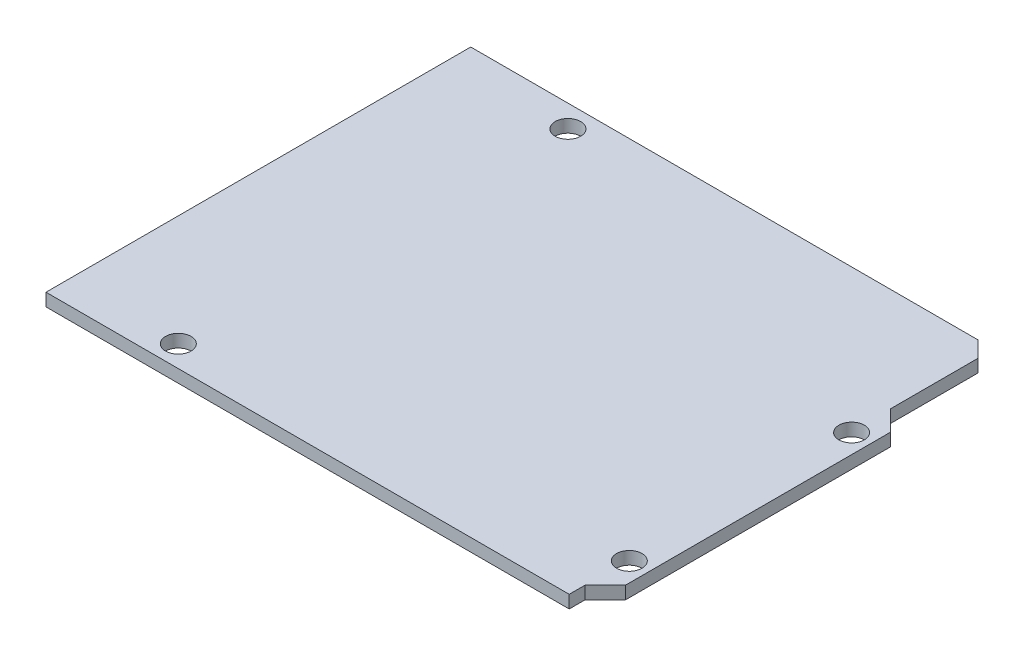
ISO-10303-21;
HEADER;
FILE_DESCRIPTION(('STEP AP214'),'2;1');
FILE_NAME('part.step','',(''),(''),'','','');
FILE_SCHEMA(('AUTOMOTIVE_DESIGN { 1 0 10303 214 1 1 1 1 }'));
ENDSEC;
DATA;
#1=APPLICATION_CONTEXT('core data for automotive mechanical design processes');
#2=APPLICATION_PROTOCOL_DEFINITION('international standard','automotive_design',2000,#1);
#3=PRODUCT_CONTEXT('',#1,'mechanical');
#4=PRODUCT('Part','Part','',(#3));
#5=PRODUCT_RELATED_PRODUCT_CATEGORY('part','',(#4));
#6=PRODUCT_DEFINITION_FORMATION('','',#4);
#7=PRODUCT_DEFINITION_CONTEXT('part definition',#1,'design');
#8=PRODUCT_DEFINITION('design','',#6,#7);
#9=PRODUCT_DEFINITION_SHAPE('','',#8);
#10=(LENGTH_UNIT() NAMED_UNIT(*) SI_UNIT(.MILLI.,.METRE.));
#11=(NAMED_UNIT(*) PLANE_ANGLE_UNIT() SI_UNIT($,.RADIAN.));
#12=(NAMED_UNIT(*) SI_UNIT($,.STERADIAN.) SOLID_ANGLE_UNIT());
#13=UNCERTAINTY_MEASURE_WITH_UNIT(LENGTH_MEASURE(1.E-05),#10,'distance_accuracy_value','');
#14=(GEOMETRIC_REPRESENTATION_CONTEXT(3) GLOBAL_UNCERTAINTY_ASSIGNED_CONTEXT((#13)) GLOBAL_UNIT_ASSIGNED_CONTEXT((#10,
#11,#12)) REPRESENTATION_CONTEXT('',''));
#15=CARTESIAN_POINT('',(0.,0.,0.));
#16=DIRECTION('',(0.,0.,1.));
#17=DIRECTION('',(1.,0.,0.));
#18=AXIS2_PLACEMENT_3D('',#15,#16,#17);
#19=CARTESIAN_POINT('',(31.56,1.6,26.65));
#20=DIRECTION('',(0.,0.,-1.));
#21=DIRECTION('',(-1.,0.,0.));
#22=AXIS2_PLACEMENT_3D('',#19,#20,#21);
#23=PLANE('',#22);
#24=DIRECTION('',(1.,0.,0.));
#25=VECTOR('',#24,1.);
#26=CARTESIAN_POINT('',(31.56,0.,26.65));
#27=LINE('',#26,#25);
#28=CARTESIAN_POINT('',(-34.1,0.,26.65));
#29=VERTEX_POINT('',#28);
#30=CARTESIAN_POINT('',(31.56,0.,26.65));
#31=VERTEX_POINT('',#30);
#32=EDGE_CURVE('E135',#29,#31,#27,.T.);
#33=ORIENTED_EDGE('',*,*,#32,.T.);
#34=DIRECTION('',(0.,-1.,0.));
#35=VECTOR('',#34,1.);
#36=CARTESIAN_POINT('',(31.56,1.6,26.65));
#37=LINE('',#36,#35);
#38=CARTESIAN_POINT('',(31.56,1.6,26.65));
#39=VERTEX_POINT('',#38);
#40=EDGE_CURVE('E11',#39,#31,#37,.T.);
#41=ORIENTED_EDGE('',*,*,#40,.F.);
#42=DIRECTION('',(1.,0.,0.));
#43=VECTOR('',#42,1.);
#44=CARTESIAN_POINT('',(31.56,1.6,26.65));
#45=LINE('',#44,#43);
#46=CARTESIAN_POINT('',(-34.1,1.6,26.65));
#47=VERTEX_POINT('',#46);
#48=EDGE_CURVE('E152',#47,#39,#45,.T.);
#49=ORIENTED_EDGE('',*,*,#48,.F.);
#50=DIRECTION('',(0.,-1.,0.));
#51=VECTOR('',#50,1.);
#52=CARTESIAN_POINT('',(-34.1,1.6,26.65));
#53=LINE('',#52,#51);
#54=EDGE_CURVE('E131',#47,#29,#53,.T.);
#55=ORIENTED_EDGE('',*,*,#54,.T.);
#56=EDGE_LOOP('',(#33,#41,#49,#55));
#57=FACE_BOUND('',#56,.T.);
#58=ADVANCED_FACE('F33',(#57),#23,.F.);
#59=CARTESIAN_POINT('',(31.56,1.6,24.65));
#60=DIRECTION('',(-1.,0.,0.));
#61=DIRECTION('',(0.,0.,1.));
#62=AXIS2_PLACEMENT_3D('',#59,#60,#61);
#63=PLANE('',#62);
#64=DIRECTION('',(0.,0.,-1.));
#65=VECTOR('',#64,1.);
#66=CARTESIAN_POINT('',(31.56,0.,24.65));
#67=LINE('',#66,#65);
#68=CARTESIAN_POINT('',(31.56,0.,24.65));
#69=VERTEX_POINT('',#68);
#70=EDGE_CURVE('E138',#31,#69,#67,.T.);
#71=ORIENTED_EDGE('',*,*,#70,.T.);
#72=DIRECTION('',(0.,-1.,0.));
#73=VECTOR('',#72,1.);
#74=CARTESIAN_POINT('',(31.56,1.6,24.65));
#75=LINE('',#74,#73);
#76=CARTESIAN_POINT('',(31.56,1.6,24.65));
#77=VERTEX_POINT('',#76);
#78=EDGE_CURVE('E41',#77,#69,#75,.T.);
#79=ORIENTED_EDGE('',*,*,#78,.F.);
#80=DIRECTION('',(0.,0.,-1.));
#81=VECTOR('',#80,1.);
#82=CARTESIAN_POINT('',(31.56,1.6,24.65));
#83=LINE('',#82,#81);
#84=EDGE_CURVE('E95',#39,#77,#83,.T.);
#85=ORIENTED_EDGE('',*,*,#84,.F.);
#86=ORIENTED_EDGE('',*,*,#40,.T.);
#87=EDGE_LOOP('',(#71,#79,#85,#86));
#88=FACE_BOUND('',#87,.T.);
#89=ADVANCED_FACE('F251',(#88),#63,.F.);
#90=CARTESIAN_POINT('',(34.1,1.6,22.11));
#91=DIRECTION('',(-0.707106781186551,0.,-0.707106781186544));
#92=DIRECTION('',(-0.707106781186544,0.,0.707106781186551));
#93=AXIS2_PLACEMENT_3D('',#90,#91,#92);
#94=PLANE('',#93);
#95=DIRECTION('',(0.707106781186544,0.,-0.707106781186551));
#96=VECTOR('',#95,1.);
#97=CARTESIAN_POINT('',(34.1,0.,22.11));
#98=LINE('',#97,#96);
#99=CARTESIAN_POINT('',(34.1,0.,22.11));
#100=VERTEX_POINT('',#99);
#101=EDGE_CURVE('E141',#69,#100,#98,.T.);
#102=ORIENTED_EDGE('',*,*,#101,.T.);
#103=DIRECTION('',(0.,-1.,0.));
#104=VECTOR('',#103,1.);
#105=CARTESIAN_POINT('',(34.1,1.6,22.11));
#106=LINE('',#105,#104);
#107=CARTESIAN_POINT('',(34.1,1.6,22.11));
#108=VERTEX_POINT('',#107);
#109=EDGE_CURVE('E162',#108,#100,#106,.T.);
#110=ORIENTED_EDGE('',*,*,#109,.F.);
#111=DIRECTION('',(0.707106781186544,0.,-0.707106781186551));
#112=VECTOR('',#111,1.);
#113=CARTESIAN_POINT('',(34.1,1.6,22.11));
#114=LINE('',#113,#112);
#115=EDGE_CURVE('E170',#77,#108,#114,.T.);
#116=ORIENTED_EDGE('',*,*,#115,.F.);
#117=ORIENTED_EDGE('',*,*,#78,.T.);
#118=EDGE_LOOP('',(#102,#110,#116,#117));
#119=FACE_BOUND('',#118,.T.);
#120=ADVANCED_FACE('F168',(#119),#94,.F.);
#121=CARTESIAN_POINT('',(34.1,1.6,-11.16));
#122=DIRECTION('',(-1.,0.,0.));
#123=DIRECTION('',(0.,0.,1.));
#124=AXIS2_PLACEMENT_3D('',#121,#122,#123);
#125=PLANE('',#124);
#126=DIRECTION('',(0.,0.,-1.));
#127=VECTOR('',#126,1.);
#128=CARTESIAN_POINT('',(34.1,0.,-11.16));
#129=LINE('',#128,#127);
#130=CARTESIAN_POINT('',(34.1,0.,-11.16));
#131=VERTEX_POINT('',#130);
#132=EDGE_CURVE('E143',#100,#131,#129,.T.);
#133=ORIENTED_EDGE('',*,*,#132,.T.);
#134=DIRECTION('',(0.,-1.,0.));
#135=VECTOR('',#134,1.);
#136=CARTESIAN_POINT('',(34.1,1.6,-11.16));
#137=LINE('',#136,#135);
#138=CARTESIAN_POINT('',(34.1,1.6,-11.16));
#139=VERTEX_POINT('',#138);
#140=EDGE_CURVE('E159',#139,#131,#137,.T.);
#141=ORIENTED_EDGE('',*,*,#140,.F.);
#142=DIRECTION('',(0.,0.,-1.));
#143=VECTOR('',#142,1.);
#144=CARTESIAN_POINT('',(34.1,1.6,-11.16));
#145=LINE('',#144,#143);
#146=EDGE_CURVE('E186',#108,#139,#145,.T.);
#147=ORIENTED_EDGE('',*,*,#146,.F.);
#148=ORIENTED_EDGE('',*,*,#109,.T.);
#149=EDGE_LOOP('',(#133,#141,#147,#148));
#150=FACE_BOUND('',#149,.T.);
#151=ADVANCED_FACE('F179',(#150),#125,.F.);
#152=CARTESIAN_POINT('',(31.56,1.6,-13.7));
#153=DIRECTION('',(-0.707106781186546,0.,0.707106781186549));
#154=DIRECTION('',(0.707106781186549,0.,0.707106781186546));
#155=AXIS2_PLACEMENT_3D('',#152,#153,#154);
#156=PLANE('',#155);
#157=DIRECTION('',(-0.707106781186549,0.,-0.707106781186546));
#158=VECTOR('',#157,1.);
#159=CARTESIAN_POINT('',(31.56,0.,-13.7));
#160=LINE('',#159,#158);
#161=CARTESIAN_POINT('',(31.56,0.,-13.7));
#162=VERTEX_POINT('',#161);
#163=EDGE_CURVE('E145',#131,#162,#160,.T.);
#164=ORIENTED_EDGE('',*,*,#163,.T.);
#165=DIRECTION('',(0.,-1.,0.));
#166=VECTOR('',#165,1.);
#167=CARTESIAN_POINT('',(31.56,1.6,-13.7));
#168=LINE('',#167,#166);
#169=CARTESIAN_POINT('',(31.56,1.6,-13.7));
#170=VERTEX_POINT('',#169);
#171=EDGE_CURVE('E156',#170,#162,#168,.T.);
#172=ORIENTED_EDGE('',*,*,#171,.F.);
#173=DIRECTION('',(-0.707106781186549,0.,-0.707106781186546));
#174=VECTOR('',#173,1.);
#175=CARTESIAN_POINT('',(31.56,1.6,-13.7));
#176=LINE('',#175,#174);
#177=EDGE_CURVE('E185',#139,#170,#176,.T.);
#178=ORIENTED_EDGE('',*,*,#177,.F.);
#179=ORIENTED_EDGE('',*,*,#140,.T.);
#180=EDGE_LOOP('',(#164,#172,#178,#179));
#181=FACE_BOUND('',#180,.T.);
#182=ADVANCED_FACE('F183',(#181),#156,.F.);
#183=CARTESIAN_POINT('',(31.56,1.6,-24.65));
#184=DIRECTION('',(-1.,0.,0.));
#185=DIRECTION('',(0.,0.,1.));
#186=AXIS2_PLACEMENT_3D('',#183,#184,#185);
#187=PLANE('',#186);
#188=DIRECTION('',(0.,0.,-1.));
#189=VECTOR('',#188,1.);
#190=CARTESIAN_POINT('',(31.56,0.,-24.65));
#191=LINE('',#190,#189);
#192=CARTESIAN_POINT('',(31.56,0.,-24.65));
#193=VERTEX_POINT('',#192);
#194=EDGE_CURVE('E147',#162,#193,#191,.T.);
#195=ORIENTED_EDGE('',*,*,#194,.T.);
#196=DIRECTION('',(0.,-1.,0.));
#197=VECTOR('',#196,1.);
#198=CARTESIAN_POINT('',(31.56,1.6,-24.65));
#199=LINE('',#198,#197);
#200=CARTESIAN_POINT('',(31.56,1.6,-24.65));
#201=VERTEX_POINT('',#200);
#202=EDGE_CURVE('E126',#201,#193,#199,.T.);
#203=ORIENTED_EDGE('',*,*,#202,.F.);
#204=DIRECTION('',(0.,0.,-1.));
#205=VECTOR('',#204,1.);
#206=CARTESIAN_POINT('',(31.56,1.6,-24.65));
#207=LINE('',#206,#205);
#208=EDGE_CURVE('E117',#170,#201,#207,.T.);
#209=ORIENTED_EDGE('',*,*,#208,.F.);
#210=ORIENTED_EDGE('',*,*,#171,.T.);
#211=EDGE_LOOP('',(#195,#203,#209,#210));
#212=FACE_BOUND('',#211,.T.);
#213=ADVANCED_FACE('F259',(#212),#187,.F.);
#214=CARTESIAN_POINT('',(29.56,1.6,-26.65));
#215=DIRECTION('',(-0.707106781186546,0.,0.707106781186549));
#216=DIRECTION('',(0.707106781186549,0.,0.707106781186546));
#217=AXIS2_PLACEMENT_3D('',#214,#215,#216);
#218=PLANE('',#217);
#219=DIRECTION('',(-0.707106781186549,0.,-0.707106781186546));
#220=VECTOR('',#219,1.);
#221=CARTESIAN_POINT('',(29.56,0.,-26.65));
#222=LINE('',#221,#220);
#223=CARTESIAN_POINT('',(29.56,0.,-26.65));
#224=VERTEX_POINT('',#223);
#225=EDGE_CURVE('E125',#193,#224,#222,.T.);
#226=ORIENTED_EDGE('',*,*,#225,.T.);
#227=DIRECTION('',(0.,-1.,0.));
#228=VECTOR('',#227,1.);
#229=CARTESIAN_POINT('',(29.56,1.6,-26.65));
#230=LINE('',#229,#228);
#231=CARTESIAN_POINT('',(29.56,1.6,-26.65));
#232=VERTEX_POINT('',#231);
#233=EDGE_CURVE('E122',#232,#224,#230,.T.);
#234=ORIENTED_EDGE('',*,*,#233,.F.);
#235=DIRECTION('',(-0.707106781186549,0.,-0.707106781186546));
#236=VECTOR('',#235,1.);
#237=CARTESIAN_POINT('',(29.56,1.6,-26.65));
#238=LINE('',#237,#236);
#239=EDGE_CURVE('E111',#201,#232,#238,.T.);
#240=ORIENTED_EDGE('',*,*,#239,.F.);
#241=ORIENTED_EDGE('',*,*,#202,.T.);
#242=EDGE_LOOP('',(#226,#234,#240,#241));
#243=FACE_BOUND('',#242,.T.);
#244=ADVANCED_FACE('F123',(#243),#218,.F.);
#245=CARTESIAN_POINT('',(-34.1,1.6,-26.65));
#246=DIRECTION('',(0.,0.,1.));
#247=DIRECTION('',(1.,0.,0.));
#248=AXIS2_PLACEMENT_3D('',#245,#246,#247);
#249=PLANE('',#248);
#250=DIRECTION('',(-1.,0.,0.));
#251=VECTOR('',#250,1.);
#252=CARTESIAN_POINT('',(-34.1,0.,-26.65));
#253=LINE('',#252,#251);
#254=CARTESIAN_POINT('',(-34.1,0.,-26.65));
#255=VERTEX_POINT('',#254);
#256=EDGE_CURVE('E81',#224,#255,#253,.T.);
#257=ORIENTED_EDGE('',*,*,#256,.T.);
#258=DIRECTION('',(0.,-1.,0.));
#259=VECTOR('',#258,1.);
#260=CARTESIAN_POINT('',(-34.1,1.6,-26.65));
#261=LINE('',#260,#259);
#262=CARTESIAN_POINT('',(-34.1,1.6,-26.65));
#263=VERTEX_POINT('',#262);
#264=EDGE_CURVE('E127',#263,#255,#261,.T.);
#265=ORIENTED_EDGE('',*,*,#264,.F.);
#266=DIRECTION('',(-1.,0.,0.));
#267=VECTOR('',#266,1.);
#268=CARTESIAN_POINT('',(-34.1,1.6,-26.65));
#269=LINE('',#268,#267);
#270=EDGE_CURVE('E115',#232,#263,#269,.T.);
#271=ORIENTED_EDGE('',*,*,#270,.F.);
#272=ORIENTED_EDGE('',*,*,#233,.T.);
#273=EDGE_LOOP('',(#257,#265,#271,#272));
#274=FACE_BOUND('',#273,.T.);
#275=ADVANCED_FACE('F129',(#274),#249,.F.);
#276=CARTESIAN_POINT('',(-34.1,1.6,-26.65));
#277=DIRECTION('',(1.,0.,0.));
#278=DIRECTION('',(0.,0.,-1.));
#279=AXIS2_PLACEMENT_3D('',#276,#277,#278);
#280=PLANE('',#279);
#281=DIRECTION('',(0.,0.,1.));
#282=VECTOR('',#281,1.);
#283=CARTESIAN_POINT('',(-34.1,0.,-26.65));
#284=LINE('',#283,#282);
#285=EDGE_CURVE('E87',#255,#29,#284,.T.);
#286=ORIENTED_EDGE('',*,*,#285,.T.);
#287=ORIENTED_EDGE('',*,*,#54,.F.);
#288=DIRECTION('',(0.,0.,1.));
#289=VECTOR('',#288,1.);
#290=CARTESIAN_POINT('',(-34.1,1.6,-26.65));
#291=LINE('',#290,#289);
#292=EDGE_CURVE('E49',#263,#47,#291,.T.);
#293=ORIENTED_EDGE('',*,*,#292,.F.);
#294=ORIENTED_EDGE('',*,*,#264,.T.);
#295=EDGE_LOOP('',(#286,#287,#293,#294));
#296=FACE_BOUND('',#295,.T.);
#297=ADVANCED_FACE('F228',(#296),#280,.F.);
#298=CARTESIAN_POINT('',(0.,1.6,0.));
#299=DIRECTION('',(0.,1.,0.));
#300=DIRECTION('',(0.,0.,1.));
#301=AXIS2_PLACEMENT_3D('',#298,#299,#300);
#302=PLANE('',#301);
#303=CARTESIAN_POINT('',(-19.1,1.6,-23.85));
#304=DIRECTION('',(0.,1.,0.));
#305=DIRECTION('',(0.,0.,1.));
#306=AXIS2_PLACEMENT_3D('',#303,#304,#305);
#307=CIRCLE('',#306,1.6);
#308=CARTESIAN_POINT('',(-19.1,1.6,-22.25));
#309=VERTEX_POINT('',#308);
#310=EDGE_CURVE('E206',#309,#309,#307,.T.);
#311=ORIENTED_EDGE('',*,*,#310,.F.);
#312=EDGE_LOOP('',(#311));
#313=FACE_BOUND('',#312,.T.);
#314=CARTESIAN_POINT('',(31.7,1.6,19.25));
#315=DIRECTION('',(0.,1.,0.));
#316=DIRECTION('',(0.,0.,1.));
#317=AXIS2_PLACEMENT_3D('',#314,#315,#316);
#318=CIRCLE('',#317,1.6);
#319=CARTESIAN_POINT('',(31.7,1.6,20.85));
#320=VERTEX_POINT('',#319);
#321=EDGE_CURVE('E207',#320,#320,#318,.T.);
#322=ORIENTED_EDGE('',*,*,#321,.F.);
#323=EDGE_LOOP('',(#322));
#324=FACE_BOUND('',#323,.T.);
#325=CARTESIAN_POINT('',(31.7,1.6,-8.65));
#326=DIRECTION('',(0.,1.,0.));
#327=DIRECTION('',(0.,0.,1.));
#328=AXIS2_PLACEMENT_3D('',#325,#326,#327);
#329=CIRCLE('',#328,1.6);
#330=CARTESIAN_POINT('',(31.7,1.6,-7.05));
#331=VERTEX_POINT('',#330);
#332=EDGE_CURVE('E193',#331,#331,#329,.T.);
#333=ORIENTED_EDGE('',*,*,#332,.F.);
#334=EDGE_LOOP('',(#333));
#335=FACE_BOUND('',#334,.T.);
#336=CARTESIAN_POINT('',(-20.2,1.6,23.95));
#337=DIRECTION('',(0.,1.,0.));
#338=DIRECTION('',(0.,0.,1.));
#339=AXIS2_PLACEMENT_3D('',#336,#337,#338);
#340=CIRCLE('',#339,1.6);
#341=CARTESIAN_POINT('',(-20.2,1.6,25.55));
#342=VERTEX_POINT('',#341);
#343=EDGE_CURVE('E200',#342,#342,#340,.T.);
#344=ORIENTED_EDGE('',*,*,#343,.F.);
#345=EDGE_LOOP('',(#344));
#346=FACE_BOUND('',#345,.T.);
#347=ORIENTED_EDGE('',*,*,#48,.T.);
#348=ORIENTED_EDGE('',*,*,#84,.T.);
#349=ORIENTED_EDGE('',*,*,#115,.T.);
#350=ORIENTED_EDGE('',*,*,#146,.T.);
#351=ORIENTED_EDGE('',*,*,#177,.T.);
#352=ORIENTED_EDGE('',*,*,#208,.T.);
#353=ORIENTED_EDGE('',*,*,#239,.T.);
#354=ORIENTED_EDGE('',*,*,#270,.T.);
#355=ORIENTED_EDGE('',*,*,#292,.T.);
#356=EDGE_LOOP('',(#347,#348,#349,#350,#351,#352,#353,#354,#355));
#357=FACE_BOUND('',#356,.T.);
#358=ADVANCED_FACE('F113',(#313,#324,#335,#346,#357),#302,.T.);
#359=CARTESIAN_POINT('',(0.,0.,0.));
#360=DIRECTION('',(0.,1.,0.));
#361=DIRECTION('',(0.,0.,1.));
#362=AXIS2_PLACEMENT_3D('',#359,#360,#361);
#363=PLANE('',#362);
#364=CARTESIAN_POINT('',(-19.1,0.,-23.85));
#365=DIRECTION('',(0.,1.,0.));
#366=DIRECTION('',(0.,0.,1.));
#367=AXIS2_PLACEMENT_3D('',#364,#365,#366);
#368=CIRCLE('',#367,1.6);
#369=CARTESIAN_POINT('',(-19.1,0.,-22.25));
#370=VERTEX_POINT('',#369);
#371=EDGE_CURVE('E139',#370,#370,#368,.T.);
#372=ORIENTED_EDGE('',*,*,#371,.T.);
#373=EDGE_LOOP('',(#372));
#374=FACE_BOUND('',#373,.T.);
#375=CARTESIAN_POINT('',(31.7,0.,19.25));
#376=DIRECTION('',(0.,1.,0.));
#377=DIRECTION('',(0.,0.,1.));
#378=AXIS2_PLACEMENT_3D('',#375,#376,#377);
#379=CIRCLE('',#378,1.6);
#380=CARTESIAN_POINT('',(31.7,0.,20.85));
#381=VERTEX_POINT('',#380);
#382=EDGE_CURVE('E197',#381,#381,#379,.T.);
#383=ORIENTED_EDGE('',*,*,#382,.T.);
#384=EDGE_LOOP('',(#383));
#385=FACE_BOUND('',#384,.T.);
#386=CARTESIAN_POINT('',(31.7,0.,-8.65));
#387=DIRECTION('',(0.,1.,0.));
#388=DIRECTION('',(0.,0.,1.));
#389=AXIS2_PLACEMENT_3D('',#386,#387,#388);
#390=CIRCLE('',#389,1.6);
#391=CARTESIAN_POINT('',(31.7,0.,-7.05));
#392=VERTEX_POINT('',#391);
#393=EDGE_CURVE('E196',#392,#392,#390,.T.);
#394=ORIENTED_EDGE('',*,*,#393,.T.);
#395=EDGE_LOOP('',(#394));
#396=FACE_BOUND('',#395,.T.);
#397=CARTESIAN_POINT('',(-20.2,0.,23.95));
#398=DIRECTION('',(0.,1.,0.));
#399=DIRECTION('',(0.,0.,1.));
#400=AXIS2_PLACEMENT_3D('',#397,#398,#399);
#401=CIRCLE('',#400,1.6);
#402=CARTESIAN_POINT('',(-20.2,0.,25.55));
#403=VERTEX_POINT('',#402);
#404=EDGE_CURVE('E203',#403,#403,#401,.T.);
#405=ORIENTED_EDGE('',*,*,#404,.T.);
#406=EDGE_LOOP('',(#405));
#407=FACE_BOUND('',#406,.T.);
#408=ORIENTED_EDGE('',*,*,#32,.F.);
#409=ORIENTED_EDGE('',*,*,#285,.F.);
#410=ORIENTED_EDGE('',*,*,#256,.F.);
#411=ORIENTED_EDGE('',*,*,#225,.F.);
#412=ORIENTED_EDGE('',*,*,#194,.F.);
#413=ORIENTED_EDGE('',*,*,#163,.F.);
#414=ORIENTED_EDGE('',*,*,#132,.F.);
#415=ORIENTED_EDGE('',*,*,#101,.F.);
#416=ORIENTED_EDGE('',*,*,#70,.F.);
#417=EDGE_LOOP('',(#408,#409,#410,#411,#412,#413,#414,#415,#416));
#418=FACE_BOUND('',#417,.T.);
#419=ADVANCED_FACE('F174',(#374,#385,#396,#407,#418),#363,.F.);
#420=CARTESIAN_POINT('',(-20.2,0.,23.95));
#421=DIRECTION('',(0.,1.,0.));
#422=DIRECTION('',(0.,0.,1.));
#423=AXIS2_PLACEMENT_3D('',#420,#421,#422);
#424=CYLINDRICAL_SURFACE('',#423,1.6);
#425=ORIENTED_EDGE('',*,*,#404,.F.);
#426=EDGE_LOOP('',(#425));
#427=FACE_BOUND('',#426,.T.);
#428=ORIENTED_EDGE('',*,*,#343,.T.);
#429=EDGE_LOOP('',(#428));
#430=FACE_BOUND('',#429,.T.);
#431=ADVANCED_FACE('F236',(#427,#430),#424,.F.);
#432=CARTESIAN_POINT('',(31.7,0.,-8.65));
#433=DIRECTION('',(0.,1.,0.));
#434=DIRECTION('',(0.,0.,1.));
#435=AXIS2_PLACEMENT_3D('',#432,#433,#434);
#436=CYLINDRICAL_SURFACE('',#435,1.6);
#437=ORIENTED_EDGE('',*,*,#393,.F.);
#438=EDGE_LOOP('',(#437));
#439=FACE_BOUND('',#438,.T.);
#440=ORIENTED_EDGE('',*,*,#332,.T.);
#441=EDGE_LOOP('',(#440));
#442=FACE_BOUND('',#441,.T.);
#443=ADVANCED_FACE('F238',(#439,#442),#436,.F.);
#444=CARTESIAN_POINT('',(31.7,0.,19.25));
#445=DIRECTION('',(0.,1.,0.));
#446=DIRECTION('',(0.,0.,1.));
#447=AXIS2_PLACEMENT_3D('',#444,#445,#446);
#448=CYLINDRICAL_SURFACE('',#447,1.6);
#449=ORIENTED_EDGE('',*,*,#382,.F.);
#450=EDGE_LOOP('',(#449));
#451=FACE_BOUND('',#450,.T.);
#452=ORIENTED_EDGE('',*,*,#321,.T.);
#453=EDGE_LOOP('',(#452));
#454=FACE_BOUND('',#453,.T.);
#455=ADVANCED_FACE('F222',(#451,#454),#448,.F.);
#456=CARTESIAN_POINT('',(-19.1,0.,-23.85));
#457=DIRECTION('',(0.,1.,0.));
#458=DIRECTION('',(0.,0.,1.));
#459=AXIS2_PLACEMENT_3D('',#456,#457,#458);
#460=CYLINDRICAL_SURFACE('',#459,1.6);
#461=ORIENTED_EDGE('',*,*,#371,.F.);
#462=EDGE_LOOP('',(#461));
#463=FACE_BOUND('',#462,.T.);
#464=ORIENTED_EDGE('',*,*,#310,.T.);
#465=EDGE_LOOP('',(#464));
#466=FACE_BOUND('',#465,.T.);
#467=ADVANCED_FACE('F219',(#463,#466),#460,.F.);
#468=CLOSED_SHELL('',(#58,#89,#120,#151,#182,#213,#244,#275,#297,#358,#419,#431,#443,#455,#467));
#469=MANIFOLD_SOLID_BREP('B2',#468);
#470=ADVANCED_BREP_SHAPE_REPRESENTATION('',(#18,#469),#14);
#471=SHAPE_DEFINITION_REPRESENTATION(#9,#470);
ENDSEC;
END-ISO-10303-21;
